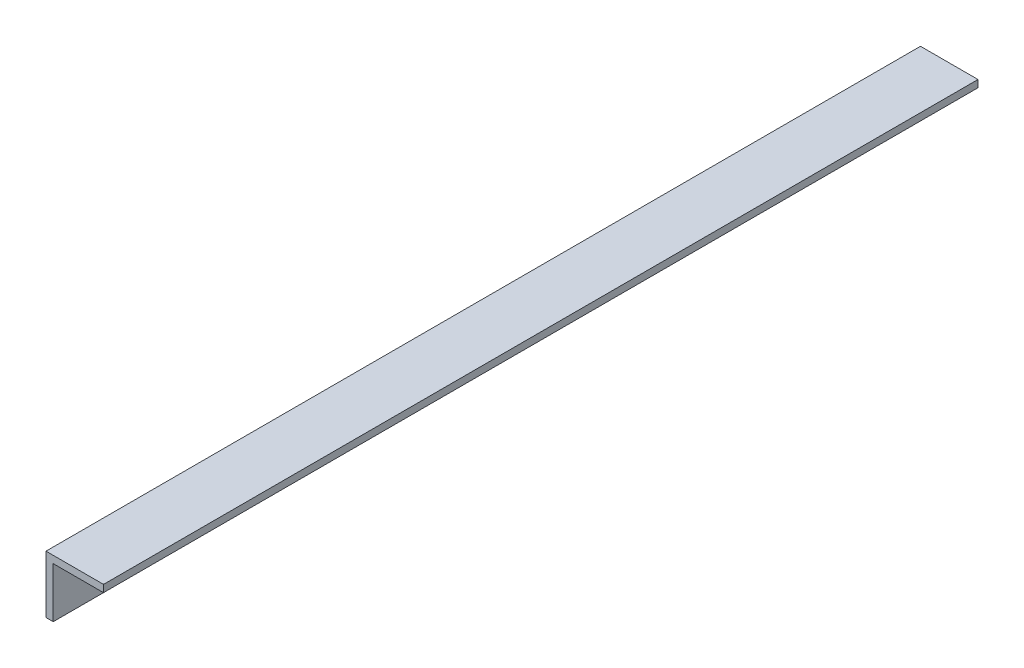
ISO-10303-21;
HEADER;
FILE_DESCRIPTION(('STEP AP214'),'2;1');
FILE_NAME('part.step','',(''),(''),'','','');
FILE_SCHEMA(('AUTOMOTIVE_DESIGN { 1 0 10303 214 1 1 1 1 }'));
ENDSEC;
DATA;
#1=APPLICATION_CONTEXT('core data for automotive mechanical design processes');
#2=APPLICATION_PROTOCOL_DEFINITION('international standard','automotive_design',2000,#1);
#3=PRODUCT_CONTEXT('',#1,'mechanical');
#4=PRODUCT('Part','Part','',(#3));
#5=PRODUCT_RELATED_PRODUCT_CATEGORY('part','',(#4));
#6=PRODUCT_DEFINITION_FORMATION('','',#4);
#7=PRODUCT_DEFINITION_CONTEXT('part definition',#1,'design');
#8=PRODUCT_DEFINITION('design','',#6,#7);
#9=PRODUCT_DEFINITION_SHAPE('','',#8);
#10=(LENGTH_UNIT() NAMED_UNIT(*) SI_UNIT(.MILLI.,.METRE.));
#11=(NAMED_UNIT(*) PLANE_ANGLE_UNIT() SI_UNIT($,.RADIAN.));
#12=(NAMED_UNIT(*) SI_UNIT($,.STERADIAN.) SOLID_ANGLE_UNIT());
#13=UNCERTAINTY_MEASURE_WITH_UNIT(LENGTH_MEASURE(1.E-05),#10,'distance_accuracy_value','');
#14=(GEOMETRIC_REPRESENTATION_CONTEXT(3) GLOBAL_UNCERTAINTY_ASSIGNED_CONTEXT((#13)) GLOBAL_UNIT_ASSIGNED_CONTEXT((#10,
#11,#12)) REPRESENTATION_CONTEXT('',''));
#15=CARTESIAN_POINT('',(0.,0.,0.));
#16=DIRECTION('',(0.,0.,1.));
#17=DIRECTION('',(1.,0.,0.));
#18=AXIS2_PLACEMENT_3D('',#15,#16,#17);
#19=CARTESIAN_POINT('',(3.175,0.,386.08));
#20=DIRECTION('',(0.,1.,0.));
#21=DIRECTION('',(-1.,0.,0.));
#22=AXIS2_PLACEMENT_3D('',#19,#20,#21);
#23=PLANE('',#22);
#24=DIRECTION('',(1.,0.,0.));
#25=VECTOR('',#24,1.);
#26=CARTESIAN_POINT('',(3.175,0.,0.));
#27=LINE('',#26,#25);
#28=CARTESIAN_POINT('',(0.,0.,0.));
#29=VERTEX_POINT('',#28);
#30=CARTESIAN_POINT('',(3.175,0.,0.));
#31=VERTEX_POINT('',#30);
#32=EDGE_CURVE('E119',#29,#31,#27,.T.);
#33=ORIENTED_EDGE('',*,*,#32,.T.);
#34=DIRECTION('',(0.,0.,-1.));
#35=VECTOR('',#34,1.);
#36=CARTESIAN_POINT('',(3.175,0.,386.08));
#37=LINE('',#36,#35);
#38=CARTESIAN_POINT('',(3.175,0.,386.08));
#39=VERTEX_POINT('',#38);
#40=EDGE_CURVE('E11',#39,#31,#37,.T.);
#41=ORIENTED_EDGE('',*,*,#40,.F.);
#42=DIRECTION('',(1.,0.,0.));
#43=VECTOR('',#42,1.);
#44=CARTESIAN_POINT('',(3.175,0.,386.08));
#45=LINE('',#44,#43);
#46=CARTESIAN_POINT('',(0.,0.,386.08));
#47=VERTEX_POINT('',#46);
#48=EDGE_CURVE('E130',#47,#39,#45,.T.);
#49=ORIENTED_EDGE('',*,*,#48,.F.);
#50=DIRECTION('',(0.,0.,-1.));
#51=VECTOR('',#50,1.);
#52=CARTESIAN_POINT('',(0.,0.,386.08));
#53=LINE('',#52,#51);
#54=EDGE_CURVE('E115',#47,#29,#53,.T.);
#55=ORIENTED_EDGE('',*,*,#54,.T.);
#56=EDGE_LOOP('',(#33,#41,#49,#55));
#57=FACE_BOUND('',#56,.T.);
#58=ADVANCED_FACE('F33',(#57),#23,.F.);
#59=CARTESIAN_POINT('',(3.175,22.225,386.08));
#60=DIRECTION('',(-1.,0.,0.));
#61=DIRECTION('',(0.,-1.,0.));
#62=AXIS2_PLACEMENT_3D('',#59,#60,#61);
#63=PLANE('',#62);
#64=CARTESIAN_POINT('',(3.175,12.7,227.33));
#65=DIRECTION('',(1.,0.,0.));
#66=DIRECTION('',(0.,1.,0.));
#67=AXIS2_PLACEMENT_3D('',#64,#65,#66);
#68=CIRCLE('',#67,3.96875000000005);
#69=CARTESIAN_POINT('',(3.175,16.66875,227.33));
#70=VERTEX_POINT('',#69);
#71=EDGE_CURVE('E144',#70,#70,#68,.T.);
#72=ORIENTED_EDGE('',*,*,#71,.F.);
#73=EDGE_LOOP('',(#72));
#74=FACE_BOUND('',#73,.T.);
#75=CARTESIAN_POINT('',(3.175,12.7,367.03));
#76=DIRECTION('',(1.,0.,0.));
#77=DIRECTION('',(0.,1.,0.));
#78=AXIS2_PLACEMENT_3D('',#75,#76,#77);
#79=CIRCLE('',#78,3.96875000000005);
#80=CARTESIAN_POINT('',(3.175,16.66875,367.03));
#81=VERTEX_POINT('',#80);
#82=EDGE_CURVE('E136',#81,#81,#79,.T.);
#83=ORIENTED_EDGE('',*,*,#82,.F.);
#84=EDGE_LOOP('',(#83));
#85=FACE_BOUND('',#84,.T.);
#86=DIRECTION('',(0.,1.,0.));
#87=VECTOR('',#86,1.);
#88=CARTESIAN_POINT('',(3.175,22.225,0.));
#89=LINE('',#88,#87);
#90=CARTESIAN_POINT('',(3.175,22.225,0.));
#91=VERTEX_POINT('',#90);
#92=EDGE_CURVE('E122',#31,#91,#89,.T.);
#93=ORIENTED_EDGE('',*,*,#92,.T.);
#94=DIRECTION('',(0.,0.,-1.));
#95=VECTOR('',#94,1.);
#96=CARTESIAN_POINT('',(3.175,22.225,386.08));
#97=LINE('',#96,#95);
#98=CARTESIAN_POINT('',(3.175,22.225,386.08));
#99=VERTEX_POINT('',#98);
#100=EDGE_CURVE('E42',#99,#91,#97,.T.);
#101=ORIENTED_EDGE('',*,*,#100,.F.);
#102=DIRECTION('',(0.,1.,0.));
#103=VECTOR('',#102,1.);
#104=CARTESIAN_POINT('',(3.175,22.225,386.08));
#105=LINE('',#104,#103);
#106=EDGE_CURVE('E88',#39,#99,#105,.T.);
#107=ORIENTED_EDGE('',*,*,#106,.F.);
#108=ORIENTED_EDGE('',*,*,#40,.T.);
#109=EDGE_LOOP('',(#93,#101,#107,#108));
#110=FACE_BOUND('',#109,.T.);
#111=ADVANCED_FACE('F150',(#74,#85,#110),#63,.F.);
#112=CARTESIAN_POINT('',(25.4,22.225,386.08));
#113=DIRECTION('',(0.,1.,0.));
#114=DIRECTION('',(-1.,0.,0.));
#115=AXIS2_PLACEMENT_3D('',#112,#113,#114);
#116=PLANE('',#115);
#117=DIRECTION('',(1.,0.,0.));
#118=VECTOR('',#117,1.);
#119=CARTESIAN_POINT('',(25.4,22.225,0.));
#120=LINE('',#119,#118);
#121=CARTESIAN_POINT('',(25.4,22.225,0.));
#122=VERTEX_POINT('',#121);
#123=EDGE_CURVE('E125',#91,#122,#120,.T.);
#124=ORIENTED_EDGE('',*,*,#123,.T.);
#125=DIRECTION('',(0.,0.,-1.));
#126=VECTOR('',#125,1.);
#127=CARTESIAN_POINT('',(25.4,22.225,386.08));
#128=LINE('',#127,#126);
#129=CARTESIAN_POINT('',(25.4,22.225,386.08));
#130=VERTEX_POINT('',#129);
#131=EDGE_CURVE('E110',#130,#122,#128,.T.);
#132=ORIENTED_EDGE('',*,*,#131,.F.);
#133=DIRECTION('',(1.,0.,0.));
#134=VECTOR('',#133,1.);
#135=CARTESIAN_POINT('',(25.4,22.225,386.08));
#136=LINE('',#135,#134);
#137=EDGE_CURVE('E101',#99,#130,#136,.T.);
#138=ORIENTED_EDGE('',*,*,#137,.F.);
#139=ORIENTED_EDGE('',*,*,#100,.T.);
#140=EDGE_LOOP('',(#124,#132,#138,#139));
#141=FACE_BOUND('',#140,.T.);
#142=ADVANCED_FACE('F153',(#141),#116,.F.);
#143=CARTESIAN_POINT('',(25.4,25.4,386.08));
#144=DIRECTION('',(-1.,0.,0.));
#145=DIRECTION('',(0.,0.,1.));
#146=AXIS2_PLACEMENT_3D('',#143,#144,#145);
#147=PLANE('',#146);
#148=DIRECTION('',(0.,1.,0.));
#149=VECTOR('',#148,1.);
#150=CARTESIAN_POINT('',(25.4,25.4,0.));
#151=LINE('',#150,#149);
#152=CARTESIAN_POINT('',(25.4,25.4,0.));
#153=VERTEX_POINT('',#152);
#154=EDGE_CURVE('E109',#122,#153,#151,.T.);
#155=ORIENTED_EDGE('',*,*,#154,.T.);
#156=DIRECTION('',(0.,0.,-1.));
#157=VECTOR('',#156,1.);
#158=CARTESIAN_POINT('',(25.4,25.4,386.08));
#159=LINE('',#158,#157);
#160=CARTESIAN_POINT('',(25.4,25.4,386.08));
#161=VERTEX_POINT('',#160);
#162=EDGE_CURVE('E106',#161,#153,#159,.T.);
#163=ORIENTED_EDGE('',*,*,#162,.F.);
#164=DIRECTION('',(0.,1.,0.));
#165=VECTOR('',#164,1.);
#166=CARTESIAN_POINT('',(25.4,25.4,386.08));
#167=LINE('',#166,#165);
#168=EDGE_CURVE('E95',#130,#161,#167,.T.);
#169=ORIENTED_EDGE('',*,*,#168,.F.);
#170=ORIENTED_EDGE('',*,*,#131,.T.);
#171=EDGE_LOOP('',(#155,#163,#169,#170));
#172=FACE_BOUND('',#171,.T.);
#173=ADVANCED_FACE('F107',(#172),#147,.F.);
#174=CARTESIAN_POINT('',(0.,25.4,386.08));
#175=DIRECTION('',(0.,-1.,0.));
#176=DIRECTION('',(0.,0.,-1.));
#177=AXIS2_PLACEMENT_3D('',#174,#175,#176);
#178=PLANE('',#177);
#179=DIRECTION('',(-1.,0.,0.));
#180=VECTOR('',#179,1.);
#181=CARTESIAN_POINT('',(0.,25.4,0.));
#182=LINE('',#181,#180);
#183=CARTESIAN_POINT('',(0.,25.4,0.));
#184=VERTEX_POINT('',#183);
#185=EDGE_CURVE('E74',#153,#184,#182,.T.);
#186=ORIENTED_EDGE('',*,*,#185,.T.);
#187=DIRECTION('',(0.,0.,-1.));
#188=VECTOR('',#187,1.);
#189=CARTESIAN_POINT('',(0.,25.4,386.08));
#190=LINE('',#189,#188);
#191=CARTESIAN_POINT('',(0.,25.4,386.08));
#192=VERTEX_POINT('',#191);
#193=EDGE_CURVE('E111',#192,#184,#190,.T.);
#194=ORIENTED_EDGE('',*,*,#193,.F.);
#195=DIRECTION('',(-1.,0.,0.));
#196=VECTOR('',#195,1.);
#197=CARTESIAN_POINT('',(0.,25.4,386.08));
#198=LINE('',#197,#196);
#199=EDGE_CURVE('E99',#161,#192,#198,.T.);
#200=ORIENTED_EDGE('',*,*,#199,.F.);
#201=ORIENTED_EDGE('',*,*,#162,.T.);
#202=EDGE_LOOP('',(#186,#194,#200,#201));
#203=FACE_BOUND('',#202,.T.);
#204=ADVANCED_FACE('F113',(#203),#178,.F.);
#205=CARTESIAN_POINT('',(0.,0.,386.08));
#206=DIRECTION('',(1.,0.,0.));
#207=DIRECTION('',(0.,0.,-1.));
#208=AXIS2_PLACEMENT_3D('',#205,#206,#207);
#209=PLANE('',#208);
#210=CARTESIAN_POINT('',(0.,12.7,227.33));
#211=DIRECTION('',(1.,0.,0.));
#212=DIRECTION('',(0.,0.,-1.));
#213=AXIS2_PLACEMENT_3D('',#210,#211,#212);
#214=CIRCLE('',#213,3.96875000000005);
#215=CARTESIAN_POINT('',(0.,12.7,223.36125));
#216=VERTEX_POINT('',#215);
#217=EDGE_CURVE('E36',#216,#216,#214,.T.);
#218=ORIENTED_EDGE('',*,*,#217,.T.);
#219=EDGE_LOOP('',(#218));
#220=FACE_BOUND('',#219,.T.);
#221=CARTESIAN_POINT('',(0.,12.7,367.03));
#222=DIRECTION('',(1.,0.,0.));
#223=DIRECTION('',(0.,0.,-1.));
#224=AXIS2_PLACEMENT_3D('',#221,#222,#223);
#225=CIRCLE('',#224,3.96875000000005);
#226=CARTESIAN_POINT('',(0.,12.7,363.06125));
#227=VERTEX_POINT('',#226);
#228=EDGE_CURVE('E123',#227,#227,#225,.T.);
#229=ORIENTED_EDGE('',*,*,#228,.T.);
#230=EDGE_LOOP('',(#229));
#231=FACE_BOUND('',#230,.T.);
#232=DIRECTION('',(0.,-1.,0.));
#233=VECTOR('',#232,1.);
#234=CARTESIAN_POINT('',(0.,0.,0.));
#235=LINE('',#234,#233);
#236=EDGE_CURVE('E80',#184,#29,#235,.T.);
#237=ORIENTED_EDGE('',*,*,#236,.T.);
#238=ORIENTED_EDGE('',*,*,#54,.F.);
#239=DIRECTION('',(0.,-1.,0.));
#240=VECTOR('',#239,1.);
#241=CARTESIAN_POINT('',(0.,0.,386.08));
#242=LINE('',#241,#240);
#243=EDGE_CURVE('E51',#192,#47,#242,.T.);
#244=ORIENTED_EDGE('',*,*,#243,.F.);
#245=ORIENTED_EDGE('',*,*,#193,.T.);
#246=EDGE_LOOP('',(#237,#238,#244,#245));
#247=FACE_BOUND('',#246,.T.);
#248=ADVANCED_FACE('F158',(#220,#231,#247),#209,.F.);
#249=CARTESIAN_POINT('',(0.,0.,386.08));
#250=DIRECTION('',(0.,0.,-1.));
#251=DIRECTION('',(-1.,0.,0.));
#252=AXIS2_PLACEMENT_3D('',#249,#250,#251);
#253=PLANE('',#252);
#254=ORIENTED_EDGE('',*,*,#48,.T.);
#255=ORIENTED_EDGE('',*,*,#106,.T.);
#256=ORIENTED_EDGE('',*,*,#137,.T.);
#257=ORIENTED_EDGE('',*,*,#168,.T.);
#258=ORIENTED_EDGE('',*,*,#199,.T.);
#259=ORIENTED_EDGE('',*,*,#243,.T.);
#260=EDGE_LOOP('',(#254,#255,#256,#257,#258,#259));
#261=FACE_BOUND('',#260,.T.);
#262=ADVANCED_FACE('F97',(#261),#253,.F.);
#263=CARTESIAN_POINT('',(0.,0.,0.));
#264=DIRECTION('',(0.,0.,-1.));
#265=DIRECTION('',(-1.,0.,0.));
#266=AXIS2_PLACEMENT_3D('',#263,#264,#265);
#267=PLANE('',#266);
#268=ORIENTED_EDGE('',*,*,#32,.F.);
#269=ORIENTED_EDGE('',*,*,#236,.F.);
#270=ORIENTED_EDGE('',*,*,#185,.F.);
#271=ORIENTED_EDGE('',*,*,#154,.F.);
#272=ORIENTED_EDGE('',*,*,#123,.F.);
#273=ORIENTED_EDGE('',*,*,#92,.F.);
#274=EDGE_LOOP('',(#268,#269,#270,#271,#272,#273));
#275=FACE_BOUND('',#274,.T.);
#276=ADVANCED_FACE('F156',(#275),#267,.T.);
#277=CARTESIAN_POINT('',(-3.175,12.7,367.03));
#278=DIRECTION('',(1.,0.,0.));
#279=DIRECTION('',(0.,1.,0.));
#280=AXIS2_PLACEMENT_3D('',#277,#278,#279);
#281=CYLINDRICAL_SURFACE('',#280,3.96875000000005);
#282=ORIENTED_EDGE('',*,*,#82,.T.);
#283=EDGE_LOOP('',(#282));
#284=FACE_BOUND('',#283,.T.);
#285=ORIENTED_EDGE('',*,*,#228,.F.);
#286=EDGE_LOOP('',(#285));
#287=FACE_BOUND('',#286,.T.);
#288=ADVANCED_FACE('F205',(#284,#287),#281,.F.);
#289=CARTESIAN_POINT('',(-3.175,12.7,227.33));
#290=DIRECTION('',(1.,0.,0.));
#291=DIRECTION('',(0.,1.,0.));
#292=AXIS2_PLACEMENT_3D('',#289,#290,#291);
#293=CYLINDRICAL_SURFACE('',#292,3.96875000000005);
#294=ORIENTED_EDGE('',*,*,#71,.T.);
#295=EDGE_LOOP('',(#294));
#296=FACE_BOUND('',#295,.T.);
#297=ORIENTED_EDGE('',*,*,#217,.F.);
#298=EDGE_LOOP('',(#297));
#299=FACE_BOUND('',#298,.T.);
#300=ADVANCED_FACE('F210',(#296,#299),#293,.F.);
#301=CLOSED_SHELL('',(#58,#111,#142,#173,#204,#248,#262,#276,#288,#300));
#302=MANIFOLD_SOLID_BREP('B2',#301);
#303=ADVANCED_BREP_SHAPE_REPRESENTATION('',(#18,#302),#14);
#304=SHAPE_DEFINITION_REPRESENTATION(#9,#303);
ENDSEC;
END-ISO-10303-21;
